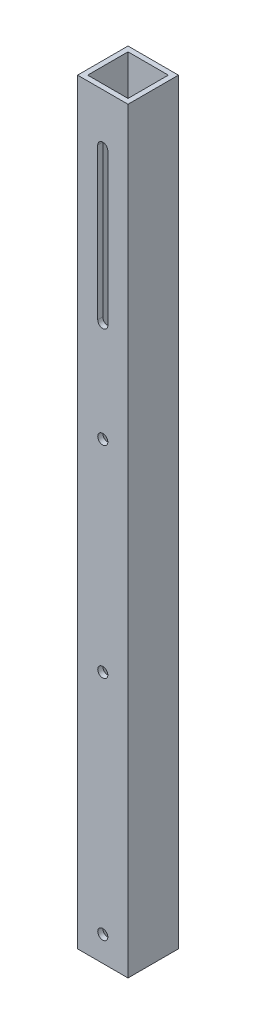
ISO-10303-21;
HEADER;
FILE_DESCRIPTION(('STEP AP214'),'2;1');
FILE_NAME('part.step','',(''),(''),'','','');
FILE_SCHEMA(('AUTOMOTIVE_DESIGN { 1 0 10303 214 1 1 1 1 }'));
ENDSEC;
DATA;
#1=APPLICATION_CONTEXT('core data for automotive mechanical design processes');
#2=APPLICATION_PROTOCOL_DEFINITION('international standard','automotive_design',2000,#1);
#3=PRODUCT_CONTEXT('',#1,'mechanical');
#4=PRODUCT('Part','Part','',(#3));
#5=PRODUCT_RELATED_PRODUCT_CATEGORY('part','',(#4));
#6=PRODUCT_DEFINITION_FORMATION('','',#4);
#7=PRODUCT_DEFINITION_CONTEXT('part definition',#1,'design');
#8=PRODUCT_DEFINITION('design','',#6,#7);
#9=PRODUCT_DEFINITION_SHAPE('','',#8);
#10=(LENGTH_UNIT() NAMED_UNIT(*) SI_UNIT(.MILLI.,.METRE.));
#11=(NAMED_UNIT(*) PLANE_ANGLE_UNIT() SI_UNIT($,.RADIAN.));
#12=(NAMED_UNIT(*) SI_UNIT($,.STERADIAN.) SOLID_ANGLE_UNIT());
#13=UNCERTAINTY_MEASURE_WITH_UNIT(LENGTH_MEASURE(1.E-05),#10,'distance_accuracy_value','');
#14=(GEOMETRIC_REPRESENTATION_CONTEXT(3) GLOBAL_UNCERTAINTY_ASSIGNED_CONTEXT((#13)) GLOBAL_UNIT_ASSIGNED_CONTEXT((#10,
#11,#12)) REPRESENTATION_CONTEXT('',''));
#15=CARTESIAN_POINT('',(0.,0.,0.));
#16=DIRECTION('',(0.,0.,1.));
#17=DIRECTION('',(1.,0.,0.));
#18=AXIS2_PLACEMENT_3D('',#15,#16,#17);
#19=CARTESIAN_POINT('',(0.,150.,0.));
#20=DIRECTION('',(0.,0.,-1.));
#21=DIRECTION('',(-1.,0.,0.));
#22=AXIS2_PLACEMENT_3D('',#19,#20,#21);
#23=PLANE('',#22);
#24=CARTESIAN_POINT('',(5.,50.,0.));
#25=DIRECTION('',(0.,0.,-1.));
#26=DIRECTION('',(-1.,0.,0.));
#27=AXIS2_PLACEMENT_3D('',#24,#25,#26);
#28=CIRCLE('',#27,1.);
#29=CARTESIAN_POINT('',(4.,50.,0.));
#30=VERTEX_POINT('',#29);
#31=EDGE_CURVE('E582',#30,#30,#28,.T.);
#32=ORIENTED_EDGE('',*,*,#31,.T.);
#33=EDGE_LOOP('',(#32));
#34=FACE_BOUND('',#33,.T.);
#35=CARTESIAN_POINT('',(5.,5.,0.));
#36=DIRECTION('',(0.,0.,-1.));
#37=DIRECTION('',(-1.,0.,0.));
#38=AXIS2_PLACEMENT_3D('',#35,#36,#37);
#39=CIRCLE('',#38,1.);
#40=CARTESIAN_POINT('',(4.,5.,0.));
#41=VERTEX_POINT('',#40);
#42=EDGE_CURVE('E225',#41,#41,#39,.T.);
#43=ORIENTED_EDGE('',*,*,#42,.T.);
#44=EDGE_LOOP('',(#43));
#45=FACE_BOUND('',#44,.T.);
#46=CARTESIAN_POINT('',(5.,90.,0.));
#47=DIRECTION('',(0.,0.,1.));
#48=DIRECTION('',(1.,0.,0.));
#49=AXIS2_PLACEMENT_3D('',#46,#47,#48);
#50=CIRCLE('',#49,1.);
#51=CARTESIAN_POINT('',(6.,90.,0.));
#52=VERTEX_POINT('',#51);
#53=EDGE_CURVE('E228',#52,#52,#50,.T.);
#54=ORIENTED_EDGE('',*,*,#53,.F.);
#55=EDGE_LOOP('',(#54));
#56=FACE_BOUND('',#55,.T.);
#57=DIRECTION('',(1.,0.,0.));
#58=VECTOR('',#57,1.);
#59=CARTESIAN_POINT('',(0.,0.,0.));
#60=LINE('',#59,#58);
#61=CARTESIAN_POINT('',(0.,0.,0.));
#62=VERTEX_POINT('',#61);
#63=CARTESIAN_POINT('',(10.,0.,0.));
#64=VERTEX_POINT('',#63);
#65=EDGE_CURVE('E289',#62,#64,#60,.T.);
#66=ORIENTED_EDGE('',*,*,#65,.T.);
#67=DIRECTION('',(0.,-1.,0.));
#68=VECTOR('',#67,1.);
#69=CARTESIAN_POINT('',(10.,150.,0.));
#70=LINE('',#69,#68);
#71=CARTESIAN_POINT('',(10.,150.,0.));
#72=VERTEX_POINT('',#71);
#73=EDGE_CURVE('E49',#72,#64,#70,.T.);
#74=ORIENTED_EDGE('',*,*,#73,.F.);
#75=DIRECTION('',(1.,0.,0.));
#76=VECTOR('',#75,1.);
#77=CARTESIAN_POINT('',(0.,150.,0.));
#78=LINE('',#77,#76);
#79=CARTESIAN_POINT('',(0.,150.,0.));
#80=VERTEX_POINT('',#79);
#81=EDGE_CURVE('E279',#80,#72,#78,.T.);
#82=ORIENTED_EDGE('',*,*,#81,.F.);
#83=DIRECTION('',(0.,-1.,0.));
#84=VECTOR('',#83,1.);
#85=CARTESIAN_POINT('',(0.,150.,0.));
#86=LINE('',#85,#84);
#87=EDGE_CURVE('E11',#80,#62,#86,.T.);
#88=ORIENTED_EDGE('',*,*,#87,.T.);
#89=EDGE_LOOP('',(#66,#74,#82,#88));
#90=FACE_BOUND('',#89,.T.);
#91=DIRECTION('',(0.,1.,0.));
#92=VECTOR('',#91,1.);
#93=CARTESIAN_POINT('',(4.,0.,0.));
#94=LINE('',#93,#92);
#95=CARTESIAN_POINT('',(4.,110.,0.));
#96=VERTEX_POINT('',#95);
#97=CARTESIAN_POINT('',(4.,140.,0.));
#98=VERTEX_POINT('',#97);
#99=EDGE_CURVE('E234',#96,#98,#94,.T.);
#100=ORIENTED_EDGE('',*,*,#99,.T.);
#101=CARTESIAN_POINT('',(5.,140.,0.));
#102=DIRECTION('',(0.,0.,1.));
#103=DIRECTION('',(1.,0.,0.));
#104=AXIS2_PLACEMENT_3D('',#101,#102,#103);
#105=CIRCLE('',#104,1.);
#106=CARTESIAN_POINT('',(6.,140.,0.));
#107=VERTEX_POINT('',#106);
#108=EDGE_CURVE('E240',#107,#98,#105,.T.);
#109=ORIENTED_EDGE('',*,*,#108,.F.);
#110=DIRECTION('',(0.,1.,0.));
#111=VECTOR('',#110,1.);
#112=CARTESIAN_POINT('',(6.,0.,0.));
#113=LINE('',#112,#111);
#114=CARTESIAN_POINT('',(6.,110.,0.));
#115=VERTEX_POINT('',#114);
#116=EDGE_CURVE('E255',#115,#107,#113,.T.);
#117=ORIENTED_EDGE('',*,*,#116,.F.);
#118=CARTESIAN_POINT('',(5.,110.,0.));
#119=DIRECTION('',(0.,0.,1.));
#120=DIRECTION('',(1.,0.,0.));
#121=AXIS2_PLACEMENT_3D('',#118,#119,#120);
#122=CIRCLE('',#121,1.);
#123=EDGE_CURVE('E252',#96,#115,#122,.T.);
#124=ORIENTED_EDGE('',*,*,#123,.F.);
#125=EDGE_LOOP('',(#100,#109,#117,#124));
#126=FACE_BOUND('',#125,.T.);
#127=ADVANCED_FACE('F40',(#34,#45,#56,#90,#126),#23,.F.);
#128=CARTESIAN_POINT('',(0.,150.,-10.));
#129=DIRECTION('',(0.,0.,1.));
#130=DIRECTION('',(1.,0.,0.));
#131=AXIS2_PLACEMENT_3D('',#128,#129,#130);
#132=PLANE('',#131);
#133=CARTESIAN_POINT('',(5.,50.,-10.));
#134=DIRECTION('',(0.,0.,-1.));
#135=DIRECTION('',(-1.,0.,0.));
#136=AXIS2_PLACEMENT_3D('',#133,#134,#135);
#137=CIRCLE('',#136,1.);
#138=CARTESIAN_POINT('',(4.,50.,-10.));
#139=VERTEX_POINT('',#138);
#140=EDGE_CURVE('E578',#139,#139,#137,.T.);
#141=ORIENTED_EDGE('',*,*,#140,.F.);
#142=EDGE_LOOP('',(#141));
#143=FACE_BOUND('',#142,.T.);
#144=CARTESIAN_POINT('',(5.,5.,-10.));
#145=DIRECTION('',(0.,0.,-1.));
#146=DIRECTION('',(-1.,0.,0.));
#147=AXIS2_PLACEMENT_3D('',#144,#145,#146);
#148=CIRCLE('',#147,1.);
#149=CARTESIAN_POINT('',(4.,5.,-10.));
#150=VERTEX_POINT('',#149);
#151=EDGE_CURVE('E224',#150,#150,#148,.T.);
#152=ORIENTED_EDGE('',*,*,#151,.F.);
#153=EDGE_LOOP('',(#152));
#154=FACE_BOUND('',#153,.T.);
#155=CARTESIAN_POINT('',(5.,90.,-10.));
#156=DIRECTION('',(0.,0.,1.));
#157=DIRECTION('',(1.,0.,0.));
#158=AXIS2_PLACEMENT_3D('',#155,#156,#157);
#159=CIRCLE('',#158,1.);
#160=CARTESIAN_POINT('',(6.,90.,-10.));
#161=VERTEX_POINT('',#160);
#162=EDGE_CURVE('E231',#161,#161,#159,.T.);
#163=ORIENTED_EDGE('',*,*,#162,.T.);
#164=EDGE_LOOP('',(#163));
#165=FACE_BOUND('',#164,.T.);
#166=DIRECTION('',(-1.,0.,0.));
#167=VECTOR('',#166,1.);
#168=CARTESIAN_POINT('',(0.,0.,-10.));
#169=LINE('',#168,#167);
#170=CARTESIAN_POINT('',(10.,0.,-10.));
#171=VERTEX_POINT('',#170);
#172=CARTESIAN_POINT('',(0.,0.,-10.));
#173=VERTEX_POINT('',#172);
#174=EDGE_CURVE('E280',#171,#173,#169,.T.);
#175=ORIENTED_EDGE('',*,*,#174,.T.);
#176=DIRECTION('',(0.,-1.,0.));
#177=VECTOR('',#176,1.);
#178=CARTESIAN_POINT('',(0.,150.,-10.));
#179=LINE('',#178,#177);
#180=CARTESIAN_POINT('',(0.,150.,-10.));
#181=VERTEX_POINT('',#180);
#182=EDGE_CURVE('E286',#181,#173,#179,.T.);
#183=ORIENTED_EDGE('',*,*,#182,.F.);
#184=DIRECTION('',(-1.,0.,0.));
#185=VECTOR('',#184,1.);
#186=CARTESIAN_POINT('',(0.,150.,-10.));
#187=LINE('',#186,#185);
#188=CARTESIAN_POINT('',(10.,150.,-10.));
#189=VERTEX_POINT('',#188);
#190=EDGE_CURVE('E284',#189,#181,#187,.T.);
#191=ORIENTED_EDGE('',*,*,#190,.F.);
#192=DIRECTION('',(0.,-1.,0.));
#193=VECTOR('',#192,1.);
#194=CARTESIAN_POINT('',(10.,150.,-10.));
#195=LINE('',#194,#193);
#196=EDGE_CURVE('E296',#189,#171,#195,.T.);
#197=ORIENTED_EDGE('',*,*,#196,.T.);
#198=EDGE_LOOP('',(#175,#183,#191,#197));
#199=FACE_BOUND('',#198,.T.);
#200=DIRECTION('',(0.,1.,0.));
#201=VECTOR('',#200,1.);
#202=CARTESIAN_POINT('',(4.,0.,-10.));
#203=LINE('',#202,#201);
#204=CARTESIAN_POINT('',(4.,110.,-10.));
#205=VERTEX_POINT('',#204);
#206=CARTESIAN_POINT('',(4.,140.,-10.));
#207=VERTEX_POINT('',#206);
#208=EDGE_CURVE('E237',#205,#207,#203,.T.);
#209=ORIENTED_EDGE('',*,*,#208,.F.);
#210=CARTESIAN_POINT('',(5.,110.,-10.));
#211=DIRECTION('',(0.,0.,1.));
#212=DIRECTION('',(1.,0.,0.));
#213=AXIS2_PLACEMENT_3D('',#210,#211,#212);
#214=CIRCLE('',#213,1.);
#215=CARTESIAN_POINT('',(6.,110.,-10.));
#216=VERTEX_POINT('',#215);
#217=EDGE_CURVE('E239',#205,#216,#214,.T.);
#218=ORIENTED_EDGE('',*,*,#217,.T.);
#219=DIRECTION('',(0.,1.,0.));
#220=VECTOR('',#219,1.);
#221=CARTESIAN_POINT('',(6.,0.,-10.));
#222=LINE('',#221,#220);
#223=CARTESIAN_POINT('',(6.,140.,-10.));
#224=VERTEX_POINT('',#223);
#225=EDGE_CURVE('E243',#216,#224,#222,.T.);
#226=ORIENTED_EDGE('',*,*,#225,.T.);
#227=CARTESIAN_POINT('',(5.,140.,-10.));
#228=DIRECTION('',(0.,0.,1.));
#229=DIRECTION('',(1.,0.,0.));
#230=AXIS2_PLACEMENT_3D('',#227,#228,#229);
#231=CIRCLE('',#230,1.);
#232=EDGE_CURVE('E246',#224,#207,#231,.T.);
#233=ORIENTED_EDGE('',*,*,#232,.T.);
#234=EDGE_LOOP('',(#209,#218,#226,#233));
#235=FACE_BOUND('',#234,.T.);
#236=ADVANCED_FACE('F329',(#143,#154,#165,#199,#235),#132,.F.);
#237=CARTESIAN_POINT('',(0.,150.,0.));
#238=DIRECTION('',(0.,-1.,0.));
#239=DIRECTION('',(0.,0.,-1.));
#240=AXIS2_PLACEMENT_3D('',#237,#238,#239);
#241=PLANE('',#240);
#242=DIRECTION('',(-1.,0.,0.));
#243=VECTOR('',#242,1.);
#244=CARTESIAN_POINT('',(0.,150.,-0.999999999999998));
#245=LINE('',#244,#243);
#246=CARTESIAN_POINT('',(9.,150.,-0.999999999999998));
#247=VERTEX_POINT('',#246);
#248=CARTESIAN_POINT('',(0.999999999999998,150.,-0.999999999999998));
#249=VERTEX_POINT('',#248);
#250=EDGE_CURVE('E160',#247,#249,#245,.T.);
#251=ORIENTED_EDGE('',*,*,#250,.T.);
#252=DIRECTION('',(0.,0.,-1.));
#253=VECTOR('',#252,1.);
#254=CARTESIAN_POINT('',(0.999999999999998,150.,0.));
#255=LINE('',#254,#253);
#256=CARTESIAN_POINT('',(0.999999999999998,150.,-9.));
#257=VERTEX_POINT('',#256);
#258=EDGE_CURVE('E167',#249,#257,#255,.T.);
#259=ORIENTED_EDGE('',*,*,#258,.T.);
#260=DIRECTION('',(1.,0.,0.));
#261=VECTOR('',#260,1.);
#262=CARTESIAN_POINT('',(0.,150.,-9.));
#263=LINE('',#262,#261);
#264=CARTESIAN_POINT('',(9.,150.,-9.));
#265=VERTEX_POINT('',#264);
#266=EDGE_CURVE('E178',#257,#265,#263,.T.);
#267=ORIENTED_EDGE('',*,*,#266,.T.);
#268=DIRECTION('',(0.,0.,1.));
#269=VECTOR('',#268,1.);
#270=CARTESIAN_POINT('',(9.,150.,0.));
#271=LINE('',#270,#269);
#272=EDGE_CURVE('E57',#265,#247,#271,.T.);
#273=ORIENTED_EDGE('',*,*,#272,.T.);
#274=EDGE_LOOP('',(#251,#259,#267,#273));
#275=FACE_BOUND('',#274,.T.);
#276=DIRECTION('',(0.,0.,1.));
#277=VECTOR('',#276,1.);
#278=CARTESIAN_POINT('',(0.,150.,0.));
#279=LINE('',#278,#277);
#280=EDGE_CURVE('E276',#181,#80,#279,.T.);
#281=ORIENTED_EDGE('',*,*,#280,.T.);
#282=ORIENTED_EDGE('',*,*,#81,.T.);
#283=DIRECTION('',(0.,0.,-1.));
#284=VECTOR('',#283,1.);
#285=CARTESIAN_POINT('',(10.,150.,0.));
#286=LINE('',#285,#284);
#287=EDGE_CURVE('E282',#72,#189,#286,.T.);
#288=ORIENTED_EDGE('',*,*,#287,.T.);
#289=ORIENTED_EDGE('',*,*,#190,.T.);
#290=EDGE_LOOP('',(#281,#282,#288,#289));
#291=FACE_BOUND('',#290,.T.);
#292=ADVANCED_FACE('F175',(#275,#291),#241,.F.);
#293=CARTESIAN_POINT('',(0.,0.,0.));
#294=DIRECTION('',(0.,-1.,0.));
#295=DIRECTION('',(0.,0.,-1.));
#296=AXIS2_PLACEMENT_3D('',#293,#294,#295);
#297=PLANE('',#296);
#298=DIRECTION('',(0.,0.,-1.));
#299=VECTOR('',#298,1.);
#300=CARTESIAN_POINT('',(0.999999999999998,0.,0.));
#301=LINE('',#300,#299);
#302=CARTESIAN_POINT('',(0.999999999999998,0.,-0.999999999999998));
#303=VERTEX_POINT('',#302);
#304=CARTESIAN_POINT('',(0.999999999999998,0.,-9.));
#305=VERTEX_POINT('',#304);
#306=EDGE_CURVE('E65',#303,#305,#301,.T.);
#307=ORIENTED_EDGE('',*,*,#306,.F.);
#308=DIRECTION('',(-1.,0.,0.));
#309=VECTOR('',#308,1.);
#310=CARTESIAN_POINT('',(0.,0.,-0.999999999999998));
#311=LINE('',#310,#309);
#312=CARTESIAN_POINT('',(9.,0.,-0.999999999999998));
#313=VERTEX_POINT('',#312);
#314=EDGE_CURVE('E162',#313,#303,#311,.T.);
#315=ORIENTED_EDGE('',*,*,#314,.F.);
#316=DIRECTION('',(0.,0.,1.));
#317=VECTOR('',#316,1.);
#318=CARTESIAN_POINT('',(9.,0.,0.));
#319=LINE('',#318,#317);
#320=CARTESIAN_POINT('',(9.,0.,-9.));
#321=VERTEX_POINT('',#320);
#322=EDGE_CURVE('E186',#321,#313,#319,.T.);
#323=ORIENTED_EDGE('',*,*,#322,.F.);
#324=DIRECTION('',(1.,0.,0.));
#325=VECTOR('',#324,1.);
#326=CARTESIAN_POINT('',(0.,0.,-9.));
#327=LINE('',#326,#325);
#328=EDGE_CURVE('E173',#305,#321,#327,.T.);
#329=ORIENTED_EDGE('',*,*,#328,.F.);
#330=EDGE_LOOP('',(#307,#315,#323,#329));
#331=FACE_BOUND('',#330,.T.);
#332=DIRECTION('',(0.,0.,1.));
#333=VECTOR('',#332,1.);
#334=CARTESIAN_POINT('',(0.,0.,0.));
#335=LINE('',#334,#333);
#336=EDGE_CURVE('E263',#173,#62,#335,.T.);
#337=ORIENTED_EDGE('',*,*,#336,.F.);
#338=ORIENTED_EDGE('',*,*,#174,.F.);
#339=DIRECTION('',(0.,0.,-1.));
#340=VECTOR('',#339,1.);
#341=CARTESIAN_POINT('',(10.,0.,0.));
#342=LINE('',#341,#340);
#343=EDGE_CURVE('E291',#64,#171,#342,.T.);
#344=ORIENTED_EDGE('',*,*,#343,.F.);
#345=ORIENTED_EDGE('',*,*,#65,.F.);
#346=EDGE_LOOP('',(#337,#338,#344,#345));
#347=FACE_BOUND('',#346,.T.);
#348=ADVANCED_FACE('F361',(#331,#347),#297,.T.);
#349=CARTESIAN_POINT('',(0.,150.,0.));
#350=DIRECTION('',(1.,0.,0.));
#351=DIRECTION('',(0.,0.,-1.));
#352=AXIS2_PLACEMENT_3D('',#349,#350,#351);
#353=PLANE('',#352);
#354=ORIENTED_EDGE('',*,*,#336,.T.);
#355=ORIENTED_EDGE('',*,*,#87,.F.);
#356=ORIENTED_EDGE('',*,*,#280,.F.);
#357=ORIENTED_EDGE('',*,*,#182,.T.);
#358=EDGE_LOOP('',(#354,#355,#356,#357));
#359=FACE_BOUND('',#358,.T.);
#360=ADVANCED_FACE('F42',(#359),#353,.F.);
#361=CARTESIAN_POINT('',(10.,150.,0.));
#362=DIRECTION('',(-1.,0.,0.));
#363=DIRECTION('',(0.,0.,1.));
#364=AXIS2_PLACEMENT_3D('',#361,#362,#363);
#365=PLANE('',#364);
#366=ORIENTED_EDGE('',*,*,#343,.T.);
#367=ORIENTED_EDGE('',*,*,#196,.F.);
#368=ORIENTED_EDGE('',*,*,#287,.F.);
#369=ORIENTED_EDGE('',*,*,#73,.T.);
#370=EDGE_LOOP('',(#366,#367,#368,#369));
#371=FACE_BOUND('',#370,.T.);
#372=ADVANCED_FACE('F336',(#371),#365,.F.);
#373=CARTESIAN_POINT('',(5.,110.,-10.));
#374=DIRECTION('',(0.,0.,1.));
#375=DIRECTION('',(1.,0.,0.));
#376=AXIS2_PLACEMENT_3D('',#373,#374,#375);
#377=CYLINDRICAL_SURFACE('',#376,1.);
#378=DIRECTION('',(0.,0.,1.));
#379=VECTOR('',#378,1.);
#380=CARTESIAN_POINT('',(4.,110.,-10.));
#381=LINE('',#380,#379);
#382=CARTESIAN_POINT('',(4.,110.,-9.));
#383=VERTEX_POINT('',#382);
#384=EDGE_CURVE('E273',#205,#383,#381,.T.);
#385=ORIENTED_EDGE('',*,*,#384,.T.);
#386=CARTESIAN_POINT('',(5.,110.,-9.));
#387=DIRECTION('',(0.,0.,-1.));
#388=DIRECTION('',(-1.,0.,0.));
#389=AXIS2_PLACEMENT_3D('',#386,#387,#388);
#390=CIRCLE('',#389,1.);
#391=CARTESIAN_POINT('',(6.,110.,-9.));
#392=VERTEX_POINT('',#391);
#393=EDGE_CURVE('E221',#383,#392,#390,.F.);
#394=ORIENTED_EDGE('',*,*,#393,.T.);
#395=DIRECTION('',(0.,0.,1.));
#396=VECTOR('',#395,1.);
#397=CARTESIAN_POINT('',(6.,110.,-10.));
#398=LINE('',#397,#396);
#399=EDGE_CURVE('E269',#216,#392,#398,.T.);
#400=ORIENTED_EDGE('',*,*,#399,.F.);
#401=ORIENTED_EDGE('',*,*,#217,.F.);
#402=EDGE_LOOP('',(#385,#394,#400,#401));
#403=FACE_BOUND('',#402,.T.);
#404=ADVANCED_FACE('F334',(#403),#377,.F.);
#405=CARTESIAN_POINT('',(6.,0.,-10.));
#406=DIRECTION('',(1.,0.,0.));
#407=DIRECTION('',(0.,0.,-1.));
#408=AXIS2_PLACEMENT_3D('',#405,#406,#407);
#409=PLANE('',#408);
#410=ORIENTED_EDGE('',*,*,#399,.T.);
#411=DIRECTION('',(0.,1.,0.));
#412=VECTOR('',#411,1.);
#413=CARTESIAN_POINT('',(6.,0.,-9.));
#414=LINE('',#413,#412);
#415=CARTESIAN_POINT('',(6.,140.,-9.));
#416=VERTEX_POINT('',#415);
#417=EDGE_CURVE('E218',#392,#416,#414,.T.);
#418=ORIENTED_EDGE('',*,*,#417,.T.);
#419=DIRECTION('',(0.,0.,1.));
#420=VECTOR('',#419,1.);
#421=CARTESIAN_POINT('',(6.,140.,-10.));
#422=LINE('',#421,#420);
#423=EDGE_CURVE('E265',#224,#416,#422,.T.);
#424=ORIENTED_EDGE('',*,*,#423,.F.);
#425=ORIENTED_EDGE('',*,*,#225,.F.);
#426=EDGE_LOOP('',(#410,#418,#424,#425));
#427=FACE_BOUND('',#426,.T.);
#428=ADVANCED_FACE('F332',(#427),#409,.F.);
#429=CARTESIAN_POINT('',(5.,140.,-10.));
#430=DIRECTION('',(0.,0.,1.));
#431=DIRECTION('',(1.,0.,0.));
#432=AXIS2_PLACEMENT_3D('',#429,#430,#431);
#433=CYLINDRICAL_SURFACE('',#432,1.);
#434=ORIENTED_EDGE('',*,*,#423,.T.);
#435=CARTESIAN_POINT('',(5.,140.,-9.));
#436=DIRECTION('',(0.,0.,-1.));
#437=DIRECTION('',(-1.,0.,0.));
#438=AXIS2_PLACEMENT_3D('',#435,#436,#437);
#439=CIRCLE('',#438,1.);
#440=CARTESIAN_POINT('',(4.,140.,-9.));
#441=VERTEX_POINT('',#440);
#442=EDGE_CURVE('E215',#416,#441,#439,.F.);
#443=ORIENTED_EDGE('',*,*,#442,.T.);
#444=DIRECTION('',(0.,0.,1.));
#445=VECTOR('',#444,1.);
#446=CARTESIAN_POINT('',(4.,140.,-10.));
#447=LINE('',#446,#445);
#448=EDGE_CURVE('E260',#207,#441,#447,.T.);
#449=ORIENTED_EDGE('',*,*,#448,.F.);
#450=ORIENTED_EDGE('',*,*,#232,.F.);
#451=EDGE_LOOP('',(#434,#443,#449,#450));
#452=FACE_BOUND('',#451,.T.);
#453=ADVANCED_FACE('F323',(#452),#433,.F.);
#454=CARTESIAN_POINT('',(4.,0.,-10.));
#455=DIRECTION('',(1.,0.,0.));
#456=DIRECTION('',(0.,0.,-1.));
#457=AXIS2_PLACEMENT_3D('',#454,#455,#456);
#458=PLANE('',#457);
#459=DIRECTION('',(0.,1.,0.));
#460=VECTOR('',#459,1.);
#461=CARTESIAN_POINT('',(4.,0.,-9.));
#462=LINE('',#461,#460);
#463=EDGE_CURVE('E213',#383,#441,#462,.T.);
#464=ORIENTED_EDGE('',*,*,#463,.F.);
#465=ORIENTED_EDGE('',*,*,#384,.F.);
#466=ORIENTED_EDGE('',*,*,#208,.T.);
#467=ORIENTED_EDGE('',*,*,#448,.T.);
#468=EDGE_LOOP('',(#464,#465,#466,#467));
#469=FACE_BOUND('',#468,.T.);
#470=ADVANCED_FACE('F325',(#469),#458,.T.);
#471=DIRECTION('',(0.,-1.,0.));
#472=VECTOR('',#471,1.);
#473=CARTESIAN_POINT('',(4.,0.,-0.999999999999999));
#474=LINE('',#473,#472);
#475=CARTESIAN_POINT('',(4.,140.,-0.999999999999999));
#476=VERTEX_POINT('',#475);
#477=CARTESIAN_POINT('',(4.,110.,-0.999999999999999));
#478=VERTEX_POINT('',#477);
#479=EDGE_CURVE('E207',#476,#478,#474,.T.);
#480=ORIENTED_EDGE('',*,*,#479,.F.);
#481=EDGE_CURVE('E264',#476,#98,#447,.T.);
#482=ORIENTED_EDGE('',*,*,#481,.T.);
#483=ORIENTED_EDGE('',*,*,#99,.F.);
#484=EDGE_CURVE('E249',#478,#96,#381,.T.);
#485=ORIENTED_EDGE('',*,*,#484,.F.);
#486=EDGE_LOOP('',(#480,#482,#483,#485));
#487=FACE_BOUND('',#486,.T.);
#488=ADVANCED_FACE('F367',(#487),#458,.T.);
#489=ORIENTED_EDGE('',*,*,#481,.F.);
#490=CARTESIAN_POINT('',(5.,140.,-0.999999999999999));
#491=DIRECTION('',(0.,0.,1.));
#492=DIRECTION('',(1.,0.,0.));
#493=AXIS2_PLACEMENT_3D('',#490,#491,#492);
#494=CIRCLE('',#493,1.);
#495=CARTESIAN_POINT('',(6.,140.,-0.999999999999999));
#496=VERTEX_POINT('',#495);
#497=EDGE_CURVE('E204',#476,#496,#494,.F.);
#498=ORIENTED_EDGE('',*,*,#497,.T.);
#499=EDGE_CURVE('E268',#496,#107,#422,.T.);
#500=ORIENTED_EDGE('',*,*,#499,.T.);
#501=ORIENTED_EDGE('',*,*,#108,.T.);
#502=EDGE_LOOP('',(#489,#498,#500,#501));
#503=FACE_BOUND('',#502,.T.);
#504=ADVANCED_FACE('F372',(#503),#433,.F.);
#505=ORIENTED_EDGE('',*,*,#499,.F.);
#506=DIRECTION('',(0.,-1.,0.));
#507=VECTOR('',#506,1.);
#508=CARTESIAN_POINT('',(6.,0.,-0.999999999999999));
#509=LINE('',#508,#507);
#510=CARTESIAN_POINT('',(6.,110.,-0.999999999999999));
#511=VERTEX_POINT('',#510);
#512=EDGE_CURVE('E201',#496,#511,#509,.T.);
#513=ORIENTED_EDGE('',*,*,#512,.T.);
#514=EDGE_CURVE('E272',#511,#115,#398,.T.);
#515=ORIENTED_EDGE('',*,*,#514,.T.);
#516=ORIENTED_EDGE('',*,*,#116,.T.);
#517=EDGE_LOOP('',(#505,#513,#515,#516));
#518=FACE_BOUND('',#517,.T.);
#519=ADVANCED_FACE('F344',(#518),#409,.F.);
#520=ORIENTED_EDGE('',*,*,#514,.F.);
#521=CARTESIAN_POINT('',(5.,110.,-0.999999999999999));
#522=DIRECTION('',(0.,0.,1.));
#523=DIRECTION('',(1.,0.,0.));
#524=AXIS2_PLACEMENT_3D('',#521,#522,#523);
#525=CIRCLE('',#524,1.);
#526=EDGE_CURVE('E198',#511,#478,#525,.F.);
#527=ORIENTED_EDGE('',*,*,#526,.T.);
#528=ORIENTED_EDGE('',*,*,#484,.T.);
#529=ORIENTED_EDGE('',*,*,#123,.T.);
#530=EDGE_LOOP('',(#520,#527,#528,#529));
#531=FACE_BOUND('',#530,.T.);
#532=ADVANCED_FACE('F338',(#531),#377,.F.);
#533=CARTESIAN_POINT('',(5.,90.,-10.));
#534=DIRECTION('',(0.,0.,1.));
#535=DIRECTION('',(1.,0.,0.));
#536=AXIS2_PLACEMENT_3D('',#533,#534,#535);
#537=CYLINDRICAL_SURFACE('',#536,1.);
#538=CARTESIAN_POINT('',(5.,90.,-9.));
#539=DIRECTION('',(0.,0.,-1.));
#540=DIRECTION('',(-1.,0.,0.));
#541=AXIS2_PLACEMENT_3D('',#538,#539,#540);
#542=CIRCLE('',#541,1.);
#543=CARTESIAN_POINT('',(4.,90.,-9.));
#544=VERTEX_POINT('',#543);
#545=EDGE_CURVE('E210',#544,#544,#542,.F.);
#546=ORIENTED_EDGE('',*,*,#545,.T.);
#547=EDGE_LOOP('',(#546));
#548=FACE_BOUND('',#547,.T.);
#549=ORIENTED_EDGE('',*,*,#162,.F.);
#550=EDGE_LOOP('',(#549));
#551=FACE_BOUND('',#550,.T.);
#552=ADVANCED_FACE('F349',(#548,#551),#537,.F.);
#553=CARTESIAN_POINT('',(5.,90.,-0.999999999999999));
#554=DIRECTION('',(0.,0.,1.));
#555=DIRECTION('',(1.,0.,0.));
#556=AXIS2_PLACEMENT_3D('',#553,#554,#555);
#557=CIRCLE('',#556,1.);
#558=CARTESIAN_POINT('',(6.,90.,-0.999999999999999));
#559=VERTEX_POINT('',#558);
#560=EDGE_CURVE('E195',#559,#559,#557,.F.);
#561=ORIENTED_EDGE('',*,*,#560,.T.);
#562=EDGE_LOOP('',(#561));
#563=FACE_BOUND('',#562,.T.);
#564=ORIENTED_EDGE('',*,*,#53,.T.);
#565=EDGE_LOOP('',(#564));
#566=FACE_BOUND('',#565,.T.);
#567=ADVANCED_FACE('F491',(#563,#566),#537,.F.);
#568=CARTESIAN_POINT('',(5.,5.,0.));
#569=DIRECTION('',(0.,0.,-1.));
#570=DIRECTION('',(-1.,0.,0.));
#571=AXIS2_PLACEMENT_3D('',#568,#569,#570);
#572=CYLINDRICAL_SURFACE('',#571,1.);
#573=CARTESIAN_POINT('',(5.,5.,-9.));
#574=DIRECTION('',(0.,0.,-1.));
#575=DIRECTION('',(-1.,0.,0.));
#576=AXIS2_PLACEMENT_3D('',#573,#574,#575);
#577=CIRCLE('',#576,1.);
#578=CARTESIAN_POINT('',(4.,5.,-9.));
#579=VERTEX_POINT('',#578);
#580=EDGE_CURVE('E209',#579,#579,#577,.F.);
#581=ORIENTED_EDGE('',*,*,#580,.T.);
#582=EDGE_LOOP('',(#581));
#583=FACE_BOUND('',#582,.T.);
#584=ORIENTED_EDGE('',*,*,#151,.T.);
#585=EDGE_LOOP('',(#584));
#586=FACE_BOUND('',#585,.T.);
#587=ADVANCED_FACE('F305',(#583,#586),#572,.F.);
#588=CARTESIAN_POINT('',(5.,5.,-0.999999999999998));
#589=DIRECTION('',(0.,0.,1.));
#590=DIRECTION('',(1.,0.,0.));
#591=AXIS2_PLACEMENT_3D('',#588,#589,#590);
#592=CIRCLE('',#591,1.);
#593=CARTESIAN_POINT('',(6.,5.,-0.999999999999998));
#594=VERTEX_POINT('',#593);
#595=EDGE_CURVE('E163',#594,#594,#592,.F.);
#596=ORIENTED_EDGE('',*,*,#595,.T.);
#597=EDGE_LOOP('',(#596));
#598=FACE_BOUND('',#597,.T.);
#599=ORIENTED_EDGE('',*,*,#42,.F.);
#600=EDGE_LOOP('',(#599));
#601=FACE_BOUND('',#600,.T.);
#602=ADVANCED_FACE('F311',(#598,#601),#572,.F.);
#603=CARTESIAN_POINT('',(0.,150.,-9.));
#604=DIRECTION('',(0.,0.,-1.));
#605=DIRECTION('',(-1.,0.,0.));
#606=AXIS2_PLACEMENT_3D('',#603,#604,#605);
#607=PLANE('',#606);
#608=CARTESIAN_POINT('',(5.,50.,-9.));
#609=DIRECTION('',(0.,0.,-1.));
#610=DIRECTION('',(-1.,0.,0.));
#611=AXIS2_PLACEMENT_3D('',#608,#609,#610);
#612=CIRCLE('',#611,1.);
#613=CARTESIAN_POINT('',(4.,50.,-9.));
#614=VERTEX_POINT('',#613);
#615=EDGE_CURVE('E184',#614,#614,#612,.T.);
#616=ORIENTED_EDGE('',*,*,#615,.T.);
#617=EDGE_LOOP('',(#616));
#618=FACE_BOUND('',#617,.T.);
#619=ORIENTED_EDGE('',*,*,#580,.F.);
#620=EDGE_LOOP('',(#619));
#621=FACE_BOUND('',#620,.T.);
#622=ORIENTED_EDGE('',*,*,#328,.T.);
#623=DIRECTION('',(0.,-1.,0.));
#624=VECTOR('',#623,1.);
#625=CARTESIAN_POINT('',(9.,150.,-9.));
#626=LINE('',#625,#624);
#627=EDGE_CURVE('E192',#265,#321,#626,.T.);
#628=ORIENTED_EDGE('',*,*,#627,.F.);
#629=ORIENTED_EDGE('',*,*,#266,.F.);
#630=DIRECTION('',(0.,-1.,0.));
#631=VECTOR('',#630,1.);
#632=CARTESIAN_POINT('',(0.999999999999998,150.,-9.));
#633=LINE('',#632,#631);
#634=EDGE_CURVE('E169',#257,#305,#633,.T.);
#635=ORIENTED_EDGE('',*,*,#634,.T.);
#636=EDGE_LOOP('',(#622,#628,#629,#635));
#637=FACE_BOUND('',#636,.T.);
#638=ORIENTED_EDGE('',*,*,#545,.F.);
#639=EDGE_LOOP('',(#638));
#640=FACE_BOUND('',#639,.T.);
#641=ORIENTED_EDGE('',*,*,#463,.T.);
#642=ORIENTED_EDGE('',*,*,#442,.F.);
#643=ORIENTED_EDGE('',*,*,#417,.F.);
#644=ORIENTED_EDGE('',*,*,#393,.F.);
#645=EDGE_LOOP('',(#641,#642,#643,#644));
#646=FACE_BOUND('',#645,.T.);
#647=ADVANCED_FACE('F308',(#618,#621,#637,#640,#646),#607,.F.);
#648=CARTESIAN_POINT('',(0.,150.,-0.999999999999998));
#649=DIRECTION('',(0.,0.,1.));
#650=DIRECTION('',(1.,0.,0.));
#651=AXIS2_PLACEMENT_3D('',#648,#649,#650);
#652=PLANE('',#651);
#653=CARTESIAN_POINT('',(5.,50.,-0.999999999999998));
#654=DIRECTION('',(0.,0.,1.));
#655=DIRECTION('',(1.,0.,0.));
#656=AXIS2_PLACEMENT_3D('',#653,#654,#655);
#657=CIRCLE('',#656,1.);
#658=CARTESIAN_POINT('',(6.,50.,-0.999999999999998));
#659=VERTEX_POINT('',#658);
#660=EDGE_CURVE('E44',#659,#659,#657,.T.);
#661=ORIENTED_EDGE('',*,*,#660,.T.);
#662=EDGE_LOOP('',(#661));
#663=FACE_BOUND('',#662,.T.);
#664=ORIENTED_EDGE('',*,*,#479,.T.);
#665=ORIENTED_EDGE('',*,*,#526,.F.);
#666=ORIENTED_EDGE('',*,*,#512,.F.);
#667=ORIENTED_EDGE('',*,*,#497,.F.);
#668=EDGE_LOOP('',(#664,#665,#666,#667));
#669=FACE_BOUND('',#668,.T.);
#670=ORIENTED_EDGE('',*,*,#595,.F.);
#671=EDGE_LOOP('',(#670));
#672=FACE_BOUND('',#671,.T.);
#673=ORIENTED_EDGE('',*,*,#314,.T.);
#674=DIRECTION('',(0.,-1.,0.));
#675=VECTOR('',#674,1.);
#676=CARTESIAN_POINT('',(0.999999999999998,150.,-0.999999999999998));
#677=LINE('',#676,#675);
#678=EDGE_CURVE('E155',#249,#303,#677,.T.);
#679=ORIENTED_EDGE('',*,*,#678,.F.);
#680=ORIENTED_EDGE('',*,*,#250,.F.);
#681=DIRECTION('',(0.,-1.,0.));
#682=VECTOR('',#681,1.);
#683=CARTESIAN_POINT('',(9.,150.,-0.999999999999998));
#684=LINE('',#683,#682);
#685=EDGE_CURVE('E164',#247,#313,#684,.T.);
#686=ORIENTED_EDGE('',*,*,#685,.T.);
#687=EDGE_LOOP('',(#673,#679,#680,#686));
#688=FACE_BOUND('',#687,.T.);
#689=ORIENTED_EDGE('',*,*,#560,.F.);
#690=EDGE_LOOP('',(#689));
#691=FACE_BOUND('',#690,.T.);
#692=ADVANCED_FACE('F157',(#663,#669,#672,#688,#691),#652,.F.);
#693=CARTESIAN_POINT('',(0.999999999999998,150.,0.));
#694=DIRECTION('',(-1.,0.,0.));
#695=DIRECTION('',(0.,0.,1.));
#696=AXIS2_PLACEMENT_3D('',#693,#694,#695);
#697=PLANE('',#696);
#698=ORIENTED_EDGE('',*,*,#306,.T.);
#699=ORIENTED_EDGE('',*,*,#634,.F.);
#700=ORIENTED_EDGE('',*,*,#258,.F.);
#701=ORIENTED_EDGE('',*,*,#678,.T.);
#702=EDGE_LOOP('',(#698,#699,#700,#701));
#703=FACE_BOUND('',#702,.T.);
#704=ADVANCED_FACE('F168',(#703),#697,.F.);
#705=CARTESIAN_POINT('',(9.,150.,0.));
#706=DIRECTION('',(1.,0.,0.));
#707=DIRECTION('',(0.,0.,-1.));
#708=AXIS2_PLACEMENT_3D('',#705,#706,#707);
#709=PLANE('',#708);
#710=ORIENTED_EDGE('',*,*,#322,.T.);
#711=ORIENTED_EDGE('',*,*,#685,.F.);
#712=ORIENTED_EDGE('',*,*,#272,.F.);
#713=ORIENTED_EDGE('',*,*,#627,.T.);
#714=EDGE_LOOP('',(#710,#711,#712,#713));
#715=FACE_BOUND('',#714,.T.);
#716=ADVANCED_FACE('F522',(#715),#709,.F.);
#717=CARTESIAN_POINT('',(5.,50.,0.));
#718=DIRECTION('',(0.,0.,-1.));
#719=DIRECTION('',(-1.,0.,0.));
#720=AXIS2_PLACEMENT_3D('',#717,#718,#719);
#721=CYLINDRICAL_SURFACE('',#720,1.);
#722=ORIENTED_EDGE('',*,*,#31,.F.);
#723=EDGE_LOOP('',(#722));
#724=FACE_BOUND('',#723,.T.);
#725=ORIENTED_EDGE('',*,*,#660,.F.);
#726=EDGE_LOOP('',(#725));
#727=FACE_BOUND('',#726,.T.);
#728=ADVANCED_FACE('F532',(#724,#727),#721,.F.);
#729=ORIENTED_EDGE('',*,*,#140,.T.);
#730=EDGE_LOOP('',(#729));
#731=FACE_BOUND('',#730,.T.);
#732=ORIENTED_EDGE('',*,*,#615,.F.);
#733=EDGE_LOOP('',(#732));
#734=FACE_BOUND('',#733,.T.);
#735=ADVANCED_FACE('F562',(#731,#734),#721,.F.);
#736=CLOSED_SHELL('',(#127,#236,#292,#348,#360,#372,#404,#428,#453,#470,#488,#504,#519,#532,
#552,#567,#587,#602,#647,#692,#704,#716,#728,#735));
#737=MANIFOLD_SOLID_BREP('B2',#736);
#738=ADVANCED_BREP_SHAPE_REPRESENTATION('',(#18,#737),#14);
#739=SHAPE_DEFINITION_REPRESENTATION(#9,#738);
ENDSEC;
END-ISO-10303-21;
